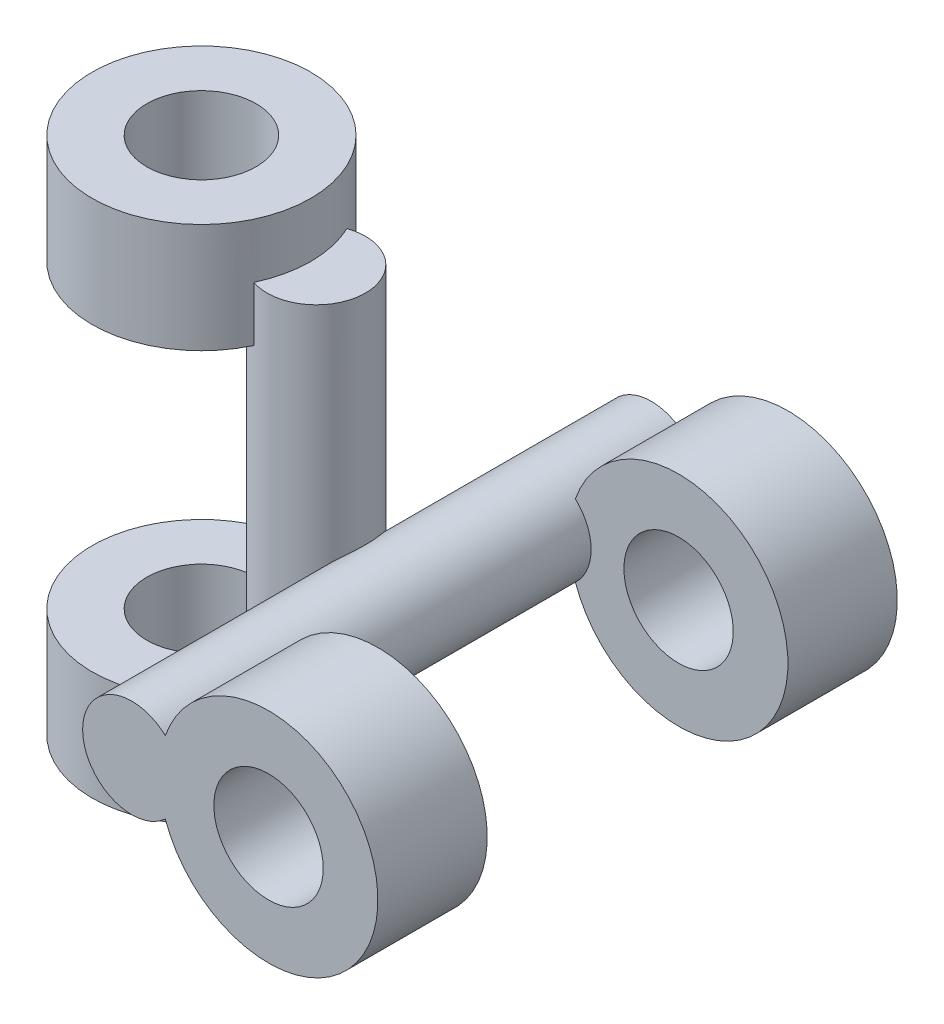
ISO-10303-21;
HEADER;
FILE_DESCRIPTION(('STEP AP214'),'2;1');
FILE_NAME('part.step','',(''),(''),'','','');
FILE_SCHEMA(('AUTOMOTIVE_DESIGN { 1 0 10303 214 1 1 1 1 }'));
ENDSEC;
DATA;
#1=APPLICATION_CONTEXT('core data for automotive mechanical design processes');
#2=APPLICATION_PROTOCOL_DEFINITION('international standard','automotive_design',2000,#1);
#3=PRODUCT_CONTEXT('',#1,'mechanical');
#4=PRODUCT('Part','Part','',(#3));
#5=PRODUCT_RELATED_PRODUCT_CATEGORY('part','',(#4));
#6=PRODUCT_DEFINITION_FORMATION('','',#4);
#7=PRODUCT_DEFINITION_CONTEXT('part definition',#1,'design');
#8=PRODUCT_DEFINITION('design','',#6,#7);
#9=PRODUCT_DEFINITION_SHAPE('','',#8);
#10=(LENGTH_UNIT() NAMED_UNIT(*) SI_UNIT(.MILLI.,.METRE.));
#11=(NAMED_UNIT(*) PLANE_ANGLE_UNIT() SI_UNIT($,.RADIAN.));
#12=(NAMED_UNIT(*) SI_UNIT($,.STERADIAN.) SOLID_ANGLE_UNIT());
#13=UNCERTAINTY_MEASURE_WITH_UNIT(LENGTH_MEASURE(1.E-05),#10,'distance_accuracy_value','');
#14=(GEOMETRIC_REPRESENTATION_CONTEXT(3) GLOBAL_UNCERTAINTY_ASSIGNED_CONTEXT((#13)) GLOBAL_UNIT_ASSIGNED_CONTEXT((#10,
#11,#12)) REPRESENTATION_CONTEXT('',''));
#15=CARTESIAN_POINT('',(0.,0.,0.));
#16=DIRECTION('',(0.,0.,1.));
#17=DIRECTION('',(1.,0.,0.));
#18=AXIS2_PLACEMENT_3D('',#15,#16,#17);
#19=CARTESIAN_POINT('',(5.97733857342843,-3.75,4.75));
#20=DIRECTION('',(0.,0.,-1.));
#21=DIRECTION('',(-1.,0.,0.));
#22=AXIS2_PLACEMENT_3D('',#19,#20,#21);
#23=CYLINDRICAL_SURFACE('',#22,2.);
#24=DIRECTION('',(0.,0.,-1.));
#25=VECTOR('',#24,1.);
#26=CARTESIAN_POINT('',(4.08933857342843,-3.09010909992636,3.75));
#27=LINE('',#26,#25);
#28=CARTESIAN_POINT('',(4.08933857342843,-3.09010909992636,4.75));
#29=VERTEX_POINT('',#28);
#30=CARTESIAN_POINT('',(4.08933857342843,-3.09010909992636,2.75));
#31=VERTEX_POINT('',#30);
#32=EDGE_CURVE('E12',#29,#31,#27,.T.);
#33=ORIENTED_EDGE('',*,*,#32,.F.);
#34=CARTESIAN_POINT('',(5.97733857342843,-3.75,4.75));
#35=DIRECTION('',(0.,0.,1.));
#36=DIRECTION('',(1.,0.,0.));
#37=AXIS2_PLACEMENT_3D('',#34,#35,#36);
#38=CIRCLE('',#37,2.);
#39=CARTESIAN_POINT('',(4.08933857342843,-4.40989090007364,4.75));
#40=VERTEX_POINT('',#39);
#41=EDGE_CURVE('E123',#40,#29,#38,.T.);
#42=ORIENTED_EDGE('',*,*,#41,.F.);
#43=DIRECTION('',(0.,0.,-1.));
#44=VECTOR('',#43,1.);
#45=CARTESIAN_POINT('',(4.08933857342843,-4.40989090007364,3.75));
#46=LINE('',#45,#44);
#47=CARTESIAN_POINT('',(4.08933857342843,-4.40989090007364,2.75));
#48=VERTEX_POINT('',#47);
#49=EDGE_CURVE('E71',#48,#40,#46,.F.);
#50=ORIENTED_EDGE('',*,*,#49,.F.);
#51=CARTESIAN_POINT('',(5.97733857342843,-3.75,2.75));
#52=DIRECTION('',(0.,0.,1.));
#53=DIRECTION('',(1.,0.,0.));
#54=AXIS2_PLACEMENT_3D('',#51,#52,#53);
#55=CIRCLE('',#54,2.);
#56=EDGE_CURVE('E135',#48,#31,#55,.T.);
#57=ORIENTED_EDGE('',*,*,#56,.T.);
#58=EDGE_LOOP('',(#33,#42,#50,#57));
#59=FACE_BOUND('',#58,.T.);
#60=ADVANCED_FACE('F65',(#59),#23,.T.);
#61=CARTESIAN_POINT('',(5.97733857342843,-3.75,-4.75));
#62=DIRECTION('',(0.,0.,1.));
#63=DIRECTION('',(1.,0.,0.));
#64=AXIS2_PLACEMENT_3D('',#61,#62,#63);
#65=CYLINDRICAL_SURFACE('',#64,2.);
#66=DIRECTION('',(0.,0.,1.));
#67=VECTOR('',#66,1.);
#68=CARTESIAN_POINT('',(4.08933857342842,-4.40989090007364,-3.75));
#69=LINE('',#68,#67);
#70=CARTESIAN_POINT('',(4.08933857342842,-4.40989090007364,-4.75));
#71=VERTEX_POINT('',#70);
#72=CARTESIAN_POINT('',(4.08933857342842,-4.40989090007364,-2.75));
#73=VERTEX_POINT('',#72);
#74=EDGE_CURVE('E81',#71,#73,#69,.T.);
#75=ORIENTED_EDGE('',*,*,#74,.F.);
#76=CARTESIAN_POINT('',(5.97733857342843,-3.75,-4.75));
#77=DIRECTION('',(0.,0.,-1.));
#78=DIRECTION('',(-1.,0.,0.));
#79=AXIS2_PLACEMENT_3D('',#76,#77,#78);
#80=CIRCLE('',#79,2.);
#81=CARTESIAN_POINT('',(4.08933857342842,-3.09010909992636,-4.75));
#82=VERTEX_POINT('',#81);
#83=EDGE_CURVE('E155',#82,#71,#80,.T.);
#84=ORIENTED_EDGE('',*,*,#83,.F.);
#85=DIRECTION('',(0.,0.,1.));
#86=VECTOR('',#85,1.);
#87=CARTESIAN_POINT('',(4.08933857342842,-3.09010909992636,-3.75));
#88=LINE('',#87,#86);
#89=CARTESIAN_POINT('',(4.08933857342842,-3.09010909992636,-2.75));
#90=VERTEX_POINT('',#89);
#91=EDGE_CURVE('E221',#90,#82,#88,.F.);
#92=ORIENTED_EDGE('',*,*,#91,.F.);
#93=CARTESIAN_POINT('',(5.97733857342843,-3.75,-2.75));
#94=DIRECTION('',(0.,0.,-1.));
#95=DIRECTION('',(-1.,0.,0.));
#96=AXIS2_PLACEMENT_3D('',#93,#94,#95);
#97=CIRCLE('',#96,2.);
#98=EDGE_CURVE('E146',#90,#73,#97,.T.);
#99=ORIENTED_EDGE('',*,*,#98,.T.);
#100=EDGE_LOOP('',(#75,#84,#92,#99));
#101=FACE_BOUND('',#100,.T.);
#102=ADVANCED_FACE('F258',(#101),#65,.T.);
#103=CARTESIAN_POINT('',(2.1,1.,0.));
#104=DIRECTION('',(0.,-1.,0.));
#105=DIRECTION('',(0.,0.,-1.));
#106=AXIS2_PLACEMENT_3D('',#103,#104,#105);
#107=CYLINDRICAL_SURFACE('',#106,0.9);
#108=CARTESIAN_POINT('',(3.,-2.98701383609051,0.));
#109=CARTESIAN_POINT('',(2.99999704860082,-2.98701228379562,0.041171140351651));
#110=CARTESIAN_POINT('',(2.99716067281994,-2.98876736715321,0.0823710837398732));
#111=CARTESIAN_POINT('',(2.98593251230094,-2.99596876099613,0.163756337113122));
#112=CARTESIAN_POINT('',(2.9775292971327,-3.00142266684778,0.203939382475297));
#113=CARTESIAN_POINT('',(2.95559386374427,-3.01654243021053,0.282151253262644));
#114=CARTESIAN_POINT('',(2.94205244782601,-3.02621584557735,0.320176074181563));
#115=CARTESIAN_POINT('',(2.91074630267744,-3.05045565764062,0.392744886532585));
#116=CARTESIAN_POINT('',(2.89298612988747,-3.06501678236007,0.427292576497246));
#117=CARTESIAN_POINT('',(2.85542726893624,-3.09897085637805,0.490540740412114));
#118=CARTESIAN_POINT('',(2.83573469144938,-3.11815392256528,0.51941633545618));
#119=CARTESIAN_POINT('',(2.79551031288702,-3.1617938788899,0.572159468892396));
#120=CARTESIAN_POINT('',(2.77497881437526,-3.18624888103186,0.59602879411737));
#121=CARTESIAN_POINT('',(2.73634914189478,-3.238228718508,0.637025325437148));
#122=CARTESIAN_POINT('',(2.71818073389659,-3.26542669028546,0.654503353043306));
#123=CARTESIAN_POINT('',(2.6841177720266,-3.32346379093281,0.685078038115853));
#124=CARTESIAN_POINT('',(2.66822383121747,-3.35430389743488,0.698173515572776));
#125=CARTESIAN_POINT('',(2.63941587837445,-3.41956360687597,0.720676207992711));
#126=CARTESIAN_POINT('',(2.62658150804762,-3.45405077228841,0.729988551744359));
#127=CARTESIAN_POINT('',(2.60511259920532,-3.52505629564309,0.745005438016039));
#128=CARTESIAN_POINT('',(2.59647955096118,-3.56157536922232,0.750708700556505));
#129=CARTESIAN_POINT('',(2.58331432889234,-3.63876055561298,0.759259694716504));
#130=CARTESIAN_POINT('',(2.57917078106064,-3.67952303683914,0.761838837235701));
#131=CARTESIAN_POINT('',(2.57647894583442,-3.76131326289757,0.76352459460216));
#132=CARTESIAN_POINT('',(2.57793289274763,-3.80234110712794,0.762629822793292));
#133=CARTESIAN_POINT('',(2.5865635777434,-3.88542569199518,0.757155256817432));
#134=CARTESIAN_POINT('',(2.59399447767257,-3.92744585117804,0.752411718970233));
#135=CARTESIAN_POINT('',(2.6144833158674,-4.00934679942082,0.738551909124956));
#136=CARTESIAN_POINT('',(2.62754027909864,-4.04922795783779,0.729436394788709));
#137=CARTESIAN_POINT('',(2.65799621735545,-4.12454549774734,0.706394676908849));
#138=CARTESIAN_POINT('',(2.67527448495549,-4.16007000431837,0.692598648673842));
#139=CARTESIAN_POINT('',(2.71293779392164,-4.22660232615398,0.659492912263982));
#140=CARTESIAN_POINT('',(2.73331989843555,-4.25761435744513,0.640188401287374));
#141=CARTESIAN_POINT('',(2.77356300408937,-4.31191790026807,0.597577164243682));
#142=CARTESIAN_POINT('',(2.7933328338278,-4.33563096744797,0.57472038634594));
#143=CARTESIAN_POINT('',(2.83217258234476,-4.37816576604408,0.524340261932098));
#144=CARTESIAN_POINT('',(2.85124252137522,-4.39698763908698,0.496817050572797));
#145=CARTESIAN_POINT('',(2.88645844918883,-4.42927386276963,0.438852370860711));
#146=CARTESIAN_POINT('',(2.90268595395536,-4.44290920223182,0.408554724191596));
#147=CARTESIAN_POINT('',(2.93196995311716,-4.46618711311233,0.345036720987054));
#148=CARTESIAN_POINT('',(2.9450254039807,-4.47582837130453,0.311815407516346));
#149=CARTESIAN_POINT('',(2.96791051282761,-4.49208718119122,0.241226467849203));
#150=CARTESIAN_POINT('',(2.97749623147546,-4.49848564372935,0.203729563338539));
#151=CARTESIAN_POINT('',(2.99178474696742,-4.50783251364521,0.127397030243456));
#152=CARTESIAN_POINT('',(2.99648563840974,-4.51077957480777,0.0885608853658828));
#153=CARTESIAN_POINT('',(3.00094589021031,-4.51358293470335,0.00760602291884393));
#154=CARTESIAN_POINT('',(3.00031468024528,-4.51319490761644,-0.0345433070180575));
#155=CARTESIAN_POINT('',(2.99319661845148,-4.50869871973567,-0.118156469479612));
#156=CARTESIAN_POINT('',(2.98670810239012,-4.50458950164117,-0.159620103768167));
#157=CARTESIAN_POINT('',(2.96806765306927,-4.49213934520187,-0.241331814729584));
#158=CARTESIAN_POINT('',(2.95582592087635,-4.48373111598626,-0.281549432803748));
#159=CARTESIAN_POINT('',(2.92645253249029,-4.46193864303342,-0.358715520109733));
#160=CARTESIAN_POINT('',(2.90932407417553,-4.44855765174941,-0.395666106643685));
#161=CARTESIAN_POINT('',(2.87262894701128,-4.41699001644056,-0.463070970685818));
#162=CARTESIAN_POINT('',(2.85325164990153,-4.39911317367278,-0.493772684725075));
#163=CARTESIAN_POINT('',(2.81308093654375,-4.35793427967372,-0.550195104861701));
#164=CARTESIAN_POINT('',(2.79228846287995,-4.33463581499575,-0.575919083353791));
#165=CARTESIAN_POINT('',(2.75283404117097,-4.28481148188122,-0.620178897886538));
#166=CARTESIAN_POINT('',(2.73413122677781,-4.25867165852207,-0.639115418316682));
#167=CARTESIAN_POINT('',(2.69865083612683,-4.2024918828404,-0.672466979503599));
#168=CARTESIAN_POINT('',(2.68187373992617,-4.17245096198446,-0.68688089437782));
#169=CARTESIAN_POINT('',(2.65128465895093,-4.10900732165546,-0.71167268092074));
#170=CARTESIAN_POINT('',(2.6374990381238,-4.07557824266362,-0.722015272841522));
#171=CARTESIAN_POINT('',(2.61387969095871,-4.00646514172054,-0.739012710862019));
#172=CARTESIAN_POINT('',(2.60404731117858,-3.97078035620922,-0.745666300701274));
#173=CARTESIAN_POINT('',(2.58821505828113,-3.89514689829226,-0.756137993731105));
#174=CARTESIAN_POINT('',(2.58258104551761,-3.85508453201481,-0.759689321157477));
#175=CARTESIAN_POINT('',(2.57675963837121,-3.77440286570635,-0.763355475242773));
#176=CARTESIAN_POINT('',(2.57657447555156,-3.73378334430709,-0.763468893915116));
#177=CARTESIAN_POINT('',(2.58180248620056,-3.6508468357521,-0.760182555317759));
#178=CARTESIAN_POINT('',(2.58751638704092,-3.6085556216288,-0.756594087797207));
#179=CARTESIAN_POINT('',(2.6047040450621,-3.52573092627635,-0.74523766530502));
#180=CARTESIAN_POINT('',(2.61617764111922,-3.48519739591161,-0.737469827248098));
#181=CARTESIAN_POINT('',(2.64394445537048,-3.40777409158616,-0.717226447246598));
#182=CARTESIAN_POINT('',(2.66016235049871,-3.37083857143091,-0.704823696455457));
#183=CARTESIAN_POINT('',(2.69622927598633,-3.30122217922903,-0.674581397741804));
#184=CARTESIAN_POINT('',(2.71607495733123,-3.26853743029445,-0.656746854181803));
#185=CARTESIAN_POINT('',(2.75595711113398,-3.2107907598018,-0.616807240404765));
#186=CARTESIAN_POINT('',(2.77586058231624,-3.18533515571002,-0.595138135332416));
#187=CARTESIAN_POINT('',(2.81545412851869,-3.13940195153821,-0.546896617690011));
#188=CARTESIAN_POINT('',(2.83514426100449,-3.11892297739725,-0.52032556213411));
#189=CARTESIAN_POINT('',(2.87167742540083,-3.0838268085449,-0.464301921833391));
#190=CARTESIAN_POINT('',(2.88861369807135,-3.06896723886265,-0.435060544151456));
#191=CARTESIAN_POINT('',(2.91960967338982,-3.04335709843012,-0.373405651041448));
#192=CARTESIAN_POINT('',(2.93366712311821,-3.03260974016089,-0.340989680330873));
#193=CARTESIAN_POINT('',(2.95868728794869,-3.01430006689983,-0.272149715068934));
#194=CARTESIAN_POINT('',(2.96945702924087,-3.00692679927016,-0.235605848816655));
#195=CARTESIAN_POINT('',(2.98630760500547,-2.9956842090224,-0.160992883742674));
#196=CARTESIAN_POINT('',(2.99239562551223,-2.9918095147997,-0.122926217160893));
#197=CARTESIAN_POINT('',(2.99867016781531,-2.9878429320388,-0.0564834972234175));
#198=CARTESIAN_POINT('',(3.00000202502731,-2.98701490115808,-0.0282485283689468));
#199=CARTESIAN_POINT('',(3.,-2.98701383609051,0.));
#200=B_SPLINE_CURVE_WITH_KNOTS('',3,(#108,#109,#110,#111,#112,#113,#114,#115,#116,#117,#118,
#119,#120,#121,#122,#123,#124,#125,#126,#127,#128,#129,#130,#131,#132,#133,#134,#135,#136,#137,
#138,#139,#140,#141,#142,#143,#144,#145,#146,#147,#148,#149,#150,#151,#152,#153,#154,#155,#156,
#157,#158,#159,#160,#161,#162,#163,#164,#165,#166,#167,#168,#169,#170,#171,#172,#173,#174,#175,
#176,#177,#178,#179,#180,#181,#182,#183,#184,#185,#186,#187,#188,#189,#190,#191,#192,#193,#194,
#195,#196,#197,#198,#199),.UNSPECIFIED.,.T.,.F.,(4,2,2,2,2,2,2,2,2,2,2,2,2,2,2,2,2,2,2,2,2,2,2,
2,2,2,2,2,2,2,2,2,2,2,2,2,2,2,2,2,2,2,2,2,2,4),(0.,0.123427570860309,0.247109365203813,
0.371013610160404,0.49478463679124,0.613743230423802,0.732659292947033,0.843395727696227,
0.954161954485012,1.06755600870333,1.18099025621167,1.30360883556898,1.42627636468916,
1.55445473013909,1.68261089034983,1.80746081877194,1.93219333982953,2.04683807024073,
2.16147948069277,2.27192165826073,2.38240011968236,2.49958533629428,2.61681624565877,
2.74270466652463,2.86862886724807,2.99658736945472,3.12446232680926,3.24520222200065,
3.36586247033036,3.47724253372853,3.5886503027394,3.70100326746639,3.81339446964274,
3.93470062349479,4.05605645729547,4.18391965480881,4.31177927563238,4.4377099319504,
4.5635249163275,4.6796271726886,4.79569733638992,4.90594926921851,5.01628715643319,
5.13221761783465,5.24796977891136,5.33265646009574),.UNSPECIFIED.);
#201=CARTESIAN_POINT('',(3.,-2.98701383609051,0.));
#202=VERTEX_POINT('',#201);
#203=EDGE_CURVE('E215',#202,#202,#200,.T.);
#204=ORIENTED_EDGE('',*,*,#203,.F.);
#205=EDGE_LOOP('',(#204));
#206=FACE_BOUND('',#205,.T.);
#207=DIRECTION('',(0.,-1.,0.));
#208=VECTOR('',#207,1.);
#209=CARTESIAN_POINT('',(1.80952380952381,-3.25,0.85183541999992));
#210=LINE('',#209,#208);
#211=CARTESIAN_POINT('',(1.80952380952381,0.,0.851835419999921));
#212=VERTEX_POINT('',#211);
#213=CARTESIAN_POINT('',(1.80952380952381,1.,0.85183541999992));
#214=VERTEX_POINT('',#213);
#215=EDGE_CURVE('E206',#212,#214,#210,.F.);
#216=ORIENTED_EDGE('',*,*,#215,.F.);
#217=CARTESIAN_POINT('',(2.1,0.,0.));
#218=DIRECTION('',(0.,1.,0.));
#219=DIRECTION('',(0.,0.,1.));
#220=AXIS2_PLACEMENT_3D('',#217,#218,#219);
#221=CIRCLE('',#220,0.9);
#222=CARTESIAN_POINT('',(1.80952380952381,0.,-0.85183541999992));
#223=VERTEX_POINT('',#222);
#224=EDGE_CURVE('E186',#223,#212,#221,.T.);
#225=ORIENTED_EDGE('',*,*,#224,.F.);
#226=DIRECTION('',(0.,-1.,0.));
#227=VECTOR('',#226,1.);
#228=CARTESIAN_POINT('',(1.80952380952381,-3.25,-0.85183541999992));
#229=LINE('',#228,#227);
#230=CARTESIAN_POINT('',(1.80952380952381,1.,-0.85183541999992));
#231=VERTEX_POINT('',#230);
#232=EDGE_CURVE('E207',#231,#223,#229,.T.);
#233=ORIENTED_EDGE('',*,*,#232,.F.);
#234=CARTESIAN_POINT('',(2.1,1.,0.));
#235=DIRECTION('',(0.,-1.,0.));
#236=DIRECTION('',(0.,0.,-1.));
#237=AXIS2_PLACEMENT_3D('',#234,#235,#236);
#238=CIRCLE('',#237,0.9);
#239=EDGE_CURVE('E187',#231,#214,#238,.T.);
#240=ORIENTED_EDGE('',*,*,#239,.T.);
#241=EDGE_LOOP('',(#216,#225,#233,#240));
#242=FACE_BOUND('',#241,.T.);
#243=DIRECTION('',(0.,-1.,0.));
#244=VECTOR('',#243,1.);
#245=CARTESIAN_POINT('',(1.80952380952381,-6.5,-0.85183541999992));
#246=LINE('',#245,#244);
#247=CARTESIAN_POINT('',(1.80952380952381,-5.5,-0.85183541999992));
#248=VERTEX_POINT('',#247);
#249=CARTESIAN_POINT('',(1.80952380952381,-7.5,-0.85183541999992));
#250=VERTEX_POINT('',#249);
#251=EDGE_CURVE('E181',#248,#250,#246,.T.);
#252=ORIENTED_EDGE('',*,*,#251,.F.);
#253=CARTESIAN_POINT('',(2.1,-5.5,0.));
#254=DIRECTION('',(0.,-1.,0.));
#255=DIRECTION('',(0.,0.,-1.));
#256=AXIS2_PLACEMENT_3D('',#253,#254,#255);
#257=CIRCLE('',#256,0.9);
#258=CARTESIAN_POINT('',(1.80952380952381,-5.5,0.85183541999992));
#259=VERTEX_POINT('',#258);
#260=EDGE_CURVE('E208',#248,#259,#257,.F.);
#261=ORIENTED_EDGE('',*,*,#260,.T.);
#262=DIRECTION('',(0.,-1.,0.));
#263=VECTOR('',#262,1.);
#264=CARTESIAN_POINT('',(1.80952380952381,-6.5,0.85183541999992));
#265=LINE('',#264,#263);
#266=CARTESIAN_POINT('',(1.80952380952381,-7.5,0.85183541999992));
#267=VERTEX_POINT('',#266);
#268=EDGE_CURVE('E176',#267,#259,#265,.F.);
#269=ORIENTED_EDGE('',*,*,#268,.F.);
#270=CARTESIAN_POINT('',(2.1,-7.5,0.));
#271=DIRECTION('',(0.,-1.,0.));
#272=DIRECTION('',(0.,0.,-1.));
#273=AXIS2_PLACEMENT_3D('',#270,#271,#272);
#274=CIRCLE('',#273,0.9);
#275=EDGE_CURVE('E182',#250,#267,#274,.T.);
#276=ORIENTED_EDGE('',*,*,#275,.F.);
#277=EDGE_LOOP('',(#252,#261,#269,#276));
#278=FACE_BOUND('',#277,.T.);
#279=ADVANCED_FACE('F224',(#206,#242,#278),#107,.T.);
#280=CARTESIAN_POINT('',(0.,2.,0.));
#281=DIRECTION('',(0.,1.,0.));
#282=DIRECTION('',(0.,0.,1.));
#283=AXIS2_PLACEMENT_3D('',#280,#281,#282);
#284=PLANE('',#283);
#285=CARTESIAN_POINT('',(0.,2.,0.));
#286=DIRECTION('',(0.,1.,0.));
#287=DIRECTION('',(1.,0.,0.));
#288=AXIS2_PLACEMENT_3D('',#285,#286,#287);
#289=CIRCLE('',#288,2.);
#290=CARTESIAN_POINT('',(2.,2.,0.));
#291=VERTEX_POINT('',#290);
#292=EDGE_CURVE('E199',#291,#291,#289,.T.);
#293=ORIENTED_EDGE('',*,*,#292,.T.);
#294=EDGE_LOOP('',(#293));
#295=FACE_BOUND('',#294,.T.);
#296=CARTESIAN_POINT('',(0.,2.,0.));
#297=DIRECTION('',(0.,1.,0.));
#298=DIRECTION('',(0.,0.,1.));
#299=AXIS2_PLACEMENT_3D('',#296,#297,#298);
#300=CIRCLE('',#299,1.);
#301=CARTESIAN_POINT('',(0.,2.,1.));
#302=VERTEX_POINT('',#301);
#303=EDGE_CURVE('E194',#302,#302,#300,.T.);
#304=ORIENTED_EDGE('',*,*,#303,.F.);
#305=EDGE_LOOP('',(#304));
#306=FACE_BOUND('',#305,.T.);
#307=ADVANCED_FACE('F272',(#295,#306),#284,.T.);
#308=CARTESIAN_POINT('',(0.,0.,0.));
#309=DIRECTION('',(0.,1.,0.));
#310=DIRECTION('',(0.,0.,1.));
#311=AXIS2_PLACEMENT_3D('',#308,#309,#310);
#312=PLANE('',#311);
#313=CARTESIAN_POINT('',(0.,0.,0.));
#314=DIRECTION('',(0.,1.,0.));
#315=DIRECTION('',(1.,0.,0.));
#316=AXIS2_PLACEMENT_3D('',#313,#314,#315);
#317=CIRCLE('',#316,2.);
#318=EDGE_CURVE('E193',#223,#212,#317,.T.);
#319=ORIENTED_EDGE('',*,*,#318,.F.);
#320=ORIENTED_EDGE('',*,*,#224,.T.);
#321=EDGE_LOOP('',(#319,#320));
#322=FACE_BOUND('',#321,.T.);
#323=CARTESIAN_POINT('',(0.,0.,0.));
#324=DIRECTION('',(0.,1.,0.));
#325=DIRECTION('',(0.,0.,1.));
#326=AXIS2_PLACEMENT_3D('',#323,#324,#325);
#327=CIRCLE('',#326,1.);
#328=CARTESIAN_POINT('',(0.,0.,1.));
#329=VERTEX_POINT('',#328);
#330=EDGE_CURVE('E192',#329,#329,#327,.T.);
#331=ORIENTED_EDGE('',*,*,#330,.T.);
#332=EDGE_LOOP('',(#331));
#333=FACE_BOUND('',#332,.T.);
#334=ADVANCED_FACE('F394',(#322,#333),#312,.F.);
#335=CARTESIAN_POINT('',(0.,2.,0.));
#336=DIRECTION('',(0.,-1.,0.));
#337=DIRECTION('',(0.,0.,-1.));
#338=AXIS2_PLACEMENT_3D('',#335,#336,#337);
#339=CYLINDRICAL_SURFACE('',#338,2.);
#340=ORIENTED_EDGE('',*,*,#318,.T.);
#341=ORIENTED_EDGE('',*,*,#215,.T.);
#342=CARTESIAN_POINT('',(0.,1.,0.));
#343=DIRECTION('',(0.,-1.,0.));
#344=DIRECTION('',(0.,0.,-1.));
#345=AXIS2_PLACEMENT_3D('',#342,#343,#344);
#346=CIRCLE('',#345,2.);
#347=EDGE_CURVE('E201',#231,#214,#346,.T.);
#348=ORIENTED_EDGE('',*,*,#347,.F.);
#349=ORIENTED_EDGE('',*,*,#232,.T.);
#350=EDGE_LOOP('',(#340,#341,#348,#349));
#351=FACE_BOUND('',#350,.T.);
#352=ORIENTED_EDGE('',*,*,#292,.F.);
#353=EDGE_LOOP('',(#352));
#354=FACE_BOUND('',#353,.T.);
#355=ADVANCED_FACE('F63',(#351,#354),#339,.T.);
#356=CARTESIAN_POINT('',(0.,2.,0.));
#357=DIRECTION('',(0.,-1.,0.));
#358=DIRECTION('',(0.,0.,-1.));
#359=AXIS2_PLACEMENT_3D('',#356,#357,#358);
#360=CYLINDRICAL_SURFACE('',#359,1.);
#361=ORIENTED_EDGE('',*,*,#303,.T.);
#362=EDGE_LOOP('',(#361));
#363=FACE_BOUND('',#362,.T.);
#364=ORIENTED_EDGE('',*,*,#330,.F.);
#365=EDGE_LOOP('',(#364));
#366=FACE_BOUND('',#365,.T.);
#367=ADVANCED_FACE('F252',(#363,#366),#360,.F.);
#368=CARTESIAN_POINT('',(2.1,1.,0.));
#369=DIRECTION('',(0.,-1.,0.));
#370=DIRECTION('',(0.,0.,-1.));
#371=AXIS2_PLACEMENT_3D('',#368,#369,#370);
#372=PLANE('',#371);
#373=ORIENTED_EDGE('',*,*,#239,.F.);
#374=ORIENTED_EDGE('',*,*,#347,.T.);
#375=EDGE_LOOP('',(#373,#374));
#376=FACE_BOUND('',#375,.T.);
#377=ADVANCED_FACE('F247',(#376),#372,.F.);
#378=CARTESIAN_POINT('',(2.1,-7.5,0.));
#379=DIRECTION('',(0.,-1.,0.));
#380=DIRECTION('',(0.,0.,-1.));
#381=AXIS2_PLACEMENT_3D('',#378,#379,#380);
#382=PLANE('',#381);
#383=ORIENTED_EDGE('',*,*,#275,.T.);
#384=CARTESIAN_POINT('',(0.,-7.5,0.));
#385=DIRECTION('',(0.,-1.,0.));
#386=DIRECTION('',(0.,0.,-1.));
#387=AXIS2_PLACEMENT_3D('',#384,#385,#386);
#388=CIRCLE('',#387,2.);
#389=EDGE_CURVE('E167',#267,#250,#388,.T.);
#390=ORIENTED_EDGE('',*,*,#389,.T.);
#391=EDGE_LOOP('',(#383,#390));
#392=FACE_BOUND('',#391,.T.);
#393=CARTESIAN_POINT('',(0.,-7.5,0.));
#394=DIRECTION('',(0.,-1.,0.));
#395=DIRECTION('',(0.,0.,-1.));
#396=AXIS2_PLACEMENT_3D('',#393,#394,#395);
#397=CIRCLE('',#396,1.);
#398=CARTESIAN_POINT('',(0.,-7.5,-1.));
#399=VERTEX_POINT('',#398);
#400=EDGE_CURVE('E168',#399,#399,#397,.T.);
#401=ORIENTED_EDGE('',*,*,#400,.F.);
#402=EDGE_LOOP('',(#401));
#403=FACE_BOUND('',#402,.T.);
#404=ADVANCED_FACE('F244',(#392,#403),#382,.T.);
#405=CARTESIAN_POINT('',(0.,-5.5,0.));
#406=DIRECTION('',(0.,-1.,0.));
#407=DIRECTION('',(0.,0.,-1.));
#408=AXIS2_PLACEMENT_3D('',#405,#406,#407);
#409=CYLINDRICAL_SURFACE('',#408,2.);
#410=CARTESIAN_POINT('',(0.,-5.5,0.));
#411=DIRECTION('',(0.,-1.,0.));
#412=DIRECTION('',(0.,0.,-1.));
#413=AXIS2_PLACEMENT_3D('',#410,#411,#412);
#414=CIRCLE('',#413,2.);
#415=EDGE_CURVE('E173',#259,#248,#414,.T.);
#416=ORIENTED_EDGE('',*,*,#415,.T.);
#417=ORIENTED_EDGE('',*,*,#251,.T.);
#418=ORIENTED_EDGE('',*,*,#389,.F.);
#419=ORIENTED_EDGE('',*,*,#268,.T.);
#420=EDGE_LOOP('',(#416,#417,#418,#419));
#421=FACE_BOUND('',#420,.T.);
#422=ADVANCED_FACE('F241',(#421),#409,.T.);
#423=CARTESIAN_POINT('',(0.,-5.5,0.));
#424=DIRECTION('',(0.,-1.,0.));
#425=DIRECTION('',(0.,0.,-1.));
#426=AXIS2_PLACEMENT_3D('',#423,#424,#425);
#427=PLANE('',#426);
#428=ORIENTED_EDGE('',*,*,#260,.F.);
#429=ORIENTED_EDGE('',*,*,#415,.F.);
#430=EDGE_LOOP('',(#428,#429));
#431=FACE_BOUND('',#430,.T.);
#432=CARTESIAN_POINT('',(0.,-5.5,0.));
#433=DIRECTION('',(0.,-1.,0.));
#434=DIRECTION('',(0.,0.,-1.));
#435=AXIS2_PLACEMENT_3D('',#432,#433,#434);
#436=CIRCLE('',#435,1.);
#437=CARTESIAN_POINT('',(0.,-5.5,-1.));
#438=VERTEX_POINT('',#437);
#439=EDGE_CURVE('E170',#438,#438,#436,.T.);
#440=ORIENTED_EDGE('',*,*,#439,.T.);
#441=EDGE_LOOP('',(#440));
#442=FACE_BOUND('',#441,.T.);
#443=ADVANCED_FACE('F240',(#431,#442),#427,.F.);
#444=CARTESIAN_POINT('',(0.,-5.5,0.));
#445=DIRECTION('',(0.,-1.,0.));
#446=DIRECTION('',(0.,0.,-1.));
#447=AXIS2_PLACEMENT_3D('',#444,#445,#446);
#448=CYLINDRICAL_SURFACE('',#447,1.);
#449=ORIENTED_EDGE('',*,*,#439,.F.);
#450=EDGE_LOOP('',(#449));
#451=FACE_BOUND('',#450,.T.);
#452=ORIENTED_EDGE('',*,*,#400,.T.);
#453=EDGE_LOOP('',(#452));
#454=FACE_BOUND('',#453,.T.);
#455=ADVANCED_FACE('F235',(#451,#454),#448,.F.);
#456=CARTESIAN_POINT('',(3.47733857342842,-3.75,-2.75));
#457=DIRECTION('',(0.,0.,1.));
#458=DIRECTION('',(1.,0.,0.));
#459=AXIS2_PLACEMENT_3D('',#456,#457,#458);
#460=CYLINDRICAL_SURFACE('',#459,0.9);
#461=ORIENTED_EDGE('',*,*,#203,.T.);
#462=EDGE_LOOP('',(#461));
#463=FACE_BOUND('',#462,.T.);
#464=CARTESIAN_POINT('',(3.47733857342842,-3.75,-2.75));
#465=DIRECTION('',(0.,0.,1.));
#466=DIRECTION('',(1.,0.,0.));
#467=AXIS2_PLACEMENT_3D('',#464,#465,#466);
#468=CIRCLE('',#467,0.9);
#469=EDGE_CURVE('E161',#73,#90,#468,.T.);
#470=ORIENTED_EDGE('',*,*,#469,.T.);
#471=ORIENTED_EDGE('',*,*,#91,.T.);
#472=CARTESIAN_POINT('',(3.47733857342842,-3.75,-4.75));
#473=DIRECTION('',(0.,0.,-1.));
#474=DIRECTION('',(-1.,0.,0.));
#475=AXIS2_PLACEMENT_3D('',#472,#473,#474);
#476=CIRCLE('',#475,0.9);
#477=EDGE_CURVE('E140',#71,#82,#476,.T.);
#478=ORIENTED_EDGE('',*,*,#477,.F.);
#479=ORIENTED_EDGE('',*,*,#74,.T.);
#480=EDGE_LOOP('',(#470,#471,#478,#479));
#481=FACE_BOUND('',#480,.T.);
#482=CARTESIAN_POINT('',(3.47733857342842,-3.75,2.75));
#483=DIRECTION('',(0.,0.,1.));
#484=DIRECTION('',(1.,0.,0.));
#485=AXIS2_PLACEMENT_3D('',#482,#483,#484);
#486=CIRCLE('',#485,0.9);
#487=EDGE_CURVE('E132',#48,#31,#486,.T.);
#488=ORIENTED_EDGE('',*,*,#487,.F.);
#489=ORIENTED_EDGE('',*,*,#49,.T.);
#490=CARTESIAN_POINT('',(3.47733857342842,-3.75,4.75));
#491=DIRECTION('',(0.,0.,1.));
#492=DIRECTION('',(1.,0.,0.));
#493=AXIS2_PLACEMENT_3D('',#490,#491,#492);
#494=CIRCLE('',#493,0.9);
#495=EDGE_CURVE('E136',#29,#40,#494,.T.);
#496=ORIENTED_EDGE('',*,*,#495,.F.);
#497=ORIENTED_EDGE('',*,*,#32,.T.);
#498=EDGE_LOOP('',(#488,#489,#496,#497));
#499=FACE_BOUND('',#498,.T.);
#500=ADVANCED_FACE('F133',(#463,#481,#499),#460,.T.);
#501=CARTESIAN_POINT('',(5.97733857342843,-3.75,2.75));
#502=DIRECTION('',(0.,0.,1.));
#503=DIRECTION('',(1.,0.,0.));
#504=AXIS2_PLACEMENT_3D('',#501,#502,#503);
#505=PLANE('',#504);
#506=CARTESIAN_POINT('',(5.97733857342843,-3.75,2.75));
#507=DIRECTION('',(0.,0.,1.));
#508=DIRECTION('',(1.,0.,0.));
#509=AXIS2_PLACEMENT_3D('',#506,#507,#508);
#510=CIRCLE('',#509,1.);
#511=CARTESIAN_POINT('',(6.97733857342842,-3.75,2.75));
#512=VERTEX_POINT('',#511);
#513=EDGE_CURVE('E151',#512,#512,#510,.T.);
#514=ORIENTED_EDGE('',*,*,#513,.T.);
#515=EDGE_LOOP('',(#514));
#516=FACE_BOUND('',#515,.T.);
#517=ORIENTED_EDGE('',*,*,#56,.F.);
#518=ORIENTED_EDGE('',*,*,#487,.T.);
#519=EDGE_LOOP('',(#517,#518));
#520=FACE_BOUND('',#519,.T.);
#521=ADVANCED_FACE('F233',(#516,#520),#505,.F.);
#522=CARTESIAN_POINT('',(5.97733857342843,-3.75,4.75));
#523=DIRECTION('',(0.,0.,1.));
#524=DIRECTION('',(1.,0.,0.));
#525=AXIS2_PLACEMENT_3D('',#522,#523,#524);
#526=PLANE('',#525);
#527=ORIENTED_EDGE('',*,*,#41,.T.);
#528=ORIENTED_EDGE('',*,*,#495,.T.);
#529=EDGE_LOOP('',(#527,#528));
#530=FACE_BOUND('',#529,.T.);
#531=CARTESIAN_POINT('',(5.97733857342843,-3.75,4.75));
#532=DIRECTION('',(0.,0.,1.));
#533=DIRECTION('',(1.,0.,0.));
#534=AXIS2_PLACEMENT_3D('',#531,#532,#533);
#535=CIRCLE('',#534,1.);
#536=CARTESIAN_POINT('',(6.97733857342842,-3.75,4.75));
#537=VERTEX_POINT('',#536);
#538=EDGE_CURVE('E156',#537,#537,#535,.T.);
#539=ORIENTED_EDGE('',*,*,#538,.F.);
#540=EDGE_LOOP('',(#539));
#541=FACE_BOUND('',#540,.T.);
#542=ADVANCED_FACE('F139',(#530,#541),#526,.T.);
#543=CARTESIAN_POINT('',(5.97733857342843,-3.75,4.75));
#544=DIRECTION('',(0.,0.,-1.));
#545=DIRECTION('',(-1.,0.,0.));
#546=AXIS2_PLACEMENT_3D('',#543,#544,#545);
#547=CYLINDRICAL_SURFACE('',#546,1.);
#548=ORIENTED_EDGE('',*,*,#538,.T.);
#549=EDGE_LOOP('',(#548));
#550=FACE_BOUND('',#549,.T.);
#551=ORIENTED_EDGE('',*,*,#513,.F.);
#552=EDGE_LOOP('',(#551));
#553=FACE_BOUND('',#552,.T.);
#554=ADVANCED_FACE('F279',(#550,#553),#547,.F.);
#555=CARTESIAN_POINT('',(5.97733857342843,-3.75,-4.75));
#556=DIRECTION('',(0.,0.,-1.));
#557=DIRECTION('',(-1.,0.,0.));
#558=AXIS2_PLACEMENT_3D('',#555,#556,#557);
#559=PLANE('',#558);
#560=ORIENTED_EDGE('',*,*,#83,.T.);
#561=ORIENTED_EDGE('',*,*,#477,.T.);
#562=EDGE_LOOP('',(#560,#561));
#563=FACE_BOUND('',#562,.T.);
#564=CARTESIAN_POINT('',(5.97733857342843,-3.75,-4.75));
#565=DIRECTION('',(0.,0.,-1.));
#566=DIRECTION('',(-1.,0.,0.));
#567=AXIS2_PLACEMENT_3D('',#564,#565,#566);
#568=CIRCLE('',#567,1.);
#569=CARTESIAN_POINT('',(4.97733857342842,-3.75,-4.75));
#570=VERTEX_POINT('',#569);
#571=EDGE_CURVE('E147',#570,#570,#568,.T.);
#572=ORIENTED_EDGE('',*,*,#571,.F.);
#573=EDGE_LOOP('',(#572));
#574=FACE_BOUND('',#573,.T.);
#575=ADVANCED_FACE('F278',(#563,#574),#559,.T.);
#576=CARTESIAN_POINT('',(5.97733857342843,-3.75,-2.75));
#577=DIRECTION('',(0.,0.,-1.));
#578=DIRECTION('',(-1.,0.,0.));
#579=AXIS2_PLACEMENT_3D('',#576,#577,#578);
#580=PLANE('',#579);
#581=ORIENTED_EDGE('',*,*,#469,.F.);
#582=ORIENTED_EDGE('',*,*,#98,.F.);
#583=EDGE_LOOP('',(#581,#582));
#584=FACE_BOUND('',#583,.T.);
#585=CARTESIAN_POINT('',(5.97733857342843,-3.75,-2.75));
#586=DIRECTION('',(0.,0.,-1.));
#587=DIRECTION('',(-1.,0.,0.));
#588=AXIS2_PLACEMENT_3D('',#585,#586,#587);
#589=CIRCLE('',#588,1.);
#590=CARTESIAN_POINT('',(4.97733857342842,-3.75,-2.75));
#591=VERTEX_POINT('',#590);
#592=EDGE_CURVE('E141',#591,#591,#589,.T.);
#593=ORIENTED_EDGE('',*,*,#592,.T.);
#594=EDGE_LOOP('',(#593));
#595=FACE_BOUND('',#594,.T.);
#596=ADVANCED_FACE('F273',(#584,#595),#580,.F.);
#597=CARTESIAN_POINT('',(5.97733857342843,-3.75,-4.75));
#598=DIRECTION('',(0.,0.,1.));
#599=DIRECTION('',(1.,0.,0.));
#600=AXIS2_PLACEMENT_3D('',#597,#598,#599);
#601=CYLINDRICAL_SURFACE('',#600,1.);
#602=ORIENTED_EDGE('',*,*,#571,.T.);
#603=EDGE_LOOP('',(#602));
#604=FACE_BOUND('',#603,.T.);
#605=ORIENTED_EDGE('',*,*,#592,.F.);
#606=EDGE_LOOP('',(#605));
#607=FACE_BOUND('',#606,.T.);
#608=ADVANCED_FACE('F327',(#604,#607),#601,.F.);
#609=CLOSED_SHELL('',(#60,#102,#279,#307,#334,#355,#367,#377,#404,#422,#443,#455,#500,#521,#542,
#554,#575,#596,#608));
#610=MANIFOLD_SOLID_BREP('B2',#609);
#611=ADVANCED_BREP_SHAPE_REPRESENTATION('',(#18,#610),#14);
#612=SHAPE_DEFINITION_REPRESENTATION(#9,#611);
ENDSEC;
END-ISO-10303-21;
